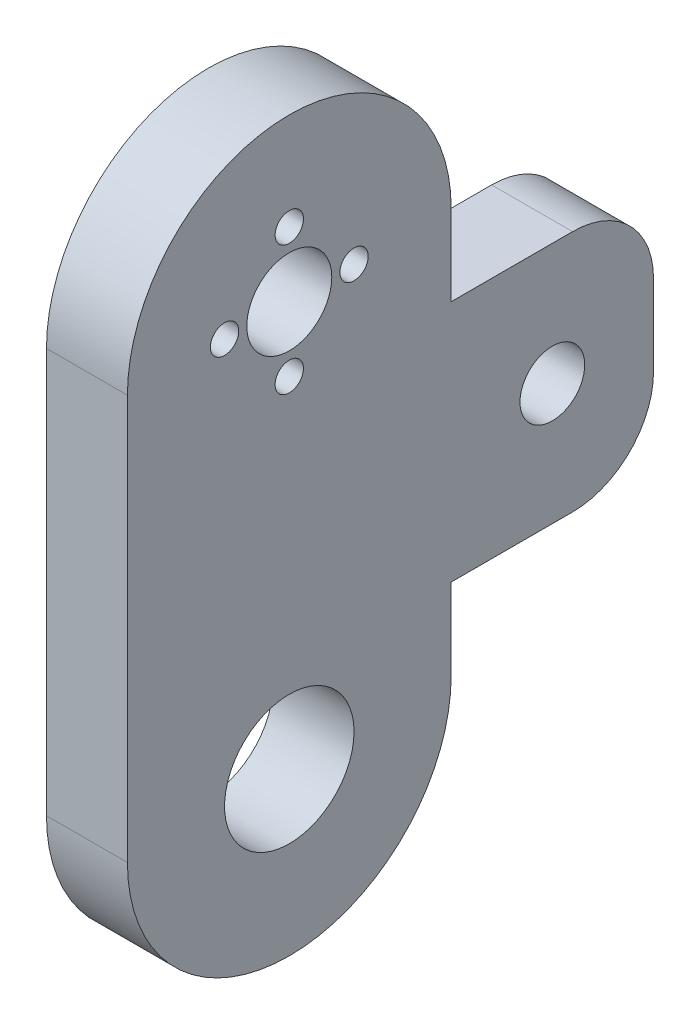
ISO-10303-21;
HEADER;
FILE_DESCRIPTION(('STEP AP214'),'2;1');
FILE_NAME('part.step','',(''),(''),'','','');
FILE_SCHEMA(('AUTOMOTIVE_DESIGN { 1 0 10303 214 1 1 1 1 }'));
ENDSEC;
DATA;
#1=APPLICATION_CONTEXT('core data for automotive mechanical design processes');
#2=APPLICATION_PROTOCOL_DEFINITION('international standard','automotive_design',2000,#1);
#3=PRODUCT_CONTEXT('',#1,'mechanical');
#4=PRODUCT('Part','Part','',(#3));
#5=PRODUCT_RELATED_PRODUCT_CATEGORY('part','',(#4));
#6=PRODUCT_DEFINITION_FORMATION('','',#4);
#7=PRODUCT_DEFINITION_CONTEXT('part definition',#1,'design');
#8=PRODUCT_DEFINITION('design','',#6,#7);
#9=PRODUCT_DEFINITION_SHAPE('','',#8);
#10=(LENGTH_UNIT() NAMED_UNIT(*) SI_UNIT(.MILLI.,.METRE.));
#11=(NAMED_UNIT(*) PLANE_ANGLE_UNIT() SI_UNIT($,.RADIAN.));
#12=(NAMED_UNIT(*) SI_UNIT($,.STERADIAN.) SOLID_ANGLE_UNIT());
#13=UNCERTAINTY_MEASURE_WITH_UNIT(LENGTH_MEASURE(1.E-05),#10,'distance_accuracy_value','');
#14=(GEOMETRIC_REPRESENTATION_CONTEXT(3) GLOBAL_UNCERTAINTY_ASSIGNED_CONTEXT((#13)) GLOBAL_UNIT_ASSIGNED_CONTEXT((#10,
#11,#12)) REPRESENTATION_CONTEXT('',''));
#15=CARTESIAN_POINT('',(0.,0.,0.));
#16=DIRECTION('',(0.,0.,1.));
#17=DIRECTION('',(1.,0.,0.));
#18=AXIS2_PLACEMENT_3D('',#15,#16,#17);
#19=CARTESIAN_POINT('',(10.,25.,0.));
#20=DIRECTION('',(1.,0.,0.));
#21=DIRECTION('',(0.,0.,-1.));
#22=AXIS2_PLACEMENT_3D('',#19,#20,#21);
#23=PLANE('',#22);
#24=CARTESIAN_POINT('',(10.,25.,7.99999999999989));
#25=DIRECTION('',(1.,0.,0.));
#26=DIRECTION('',(0.,0.,-1.));
#27=AXIS2_PLACEMENT_3D('',#24,#25,#26);
#28=CIRCLE('',#27,1.75);
#29=CARTESIAN_POINT('',(10.,25.,6.24999999999989));
#30=VERTEX_POINT('',#29);
#31=EDGE_CURVE('E236',#30,#30,#28,.T.);
#32=ORIENTED_EDGE('',*,*,#31,.F.);
#33=EDGE_LOOP('',(#32));
#34=FACE_BOUND('',#33,.T.);
#35=CARTESIAN_POINT('',(10.,25.0000000000001,-8.00000000000012));
#36=DIRECTION('',(1.,0.,0.));
#37=DIRECTION('',(0.,0.,-1.));
#38=AXIS2_PLACEMENT_3D('',#35,#36,#37);
#39=CIRCLE('',#38,1.75);
#40=CARTESIAN_POINT('',(10.,25.0000000000001,-9.75000000000011));
#41=VERTEX_POINT('',#40);
#42=EDGE_CURVE('E224',#41,#41,#39,.T.);
#43=ORIENTED_EDGE('',*,*,#42,.F.);
#44=EDGE_LOOP('',(#43));
#45=FACE_BOUND('',#44,.T.);
#46=CARTESIAN_POINT('',(10.,-25.,0.));
#47=DIRECTION('',(1.,0.,0.));
#48=DIRECTION('',(0.,0.,-1.));
#49=AXIS2_PLACEMENT_3D('',#46,#47,#48);
#50=CIRCLE('',#49,8.);
#51=CARTESIAN_POINT('',(10.,-25.,-8.));
#52=VERTEX_POINT('',#51);
#53=EDGE_CURVE('E212',#52,#52,#50,.T.);
#54=ORIENTED_EDGE('',*,*,#53,.F.);
#55=EDGE_LOOP('',(#54));
#56=FACE_BOUND('',#55,.T.);
#57=CARTESIAN_POINT('',(10.,25.,0.));
#58=DIRECTION('',(1.,0.,0.));
#59=DIRECTION('',(0.,0.,-1.));
#60=AXIS2_PLACEMENT_3D('',#57,#58,#59);
#61=CIRCLE('',#60,20.);
#62=CARTESIAN_POINT('',(10.,25.,-20.));
#63=VERTEX_POINT('',#62);
#64=CARTESIAN_POINT('',(10.,25.,20.));
#65=VERTEX_POINT('',#64);
#66=EDGE_CURVE('E161',#63,#65,#61,.T.);
#67=ORIENTED_EDGE('',*,*,#66,.T.);
#68=DIRECTION('',(0.,-1.,0.));
#69=VECTOR('',#68,1.);
#70=CARTESIAN_POINT('',(10.,-25.,20.));
#71=LINE('',#70,#69);
#72=CARTESIAN_POINT('',(10.,-25.,20.));
#73=VERTEX_POINT('',#72);
#74=EDGE_CURVE('E99',#65,#73,#71,.T.);
#75=ORIENTED_EDGE('',*,*,#74,.T.);
#76=CARTESIAN_POINT('',(10.,-25.,0.));
#77=DIRECTION('',(1.,0.,0.));
#78=DIRECTION('',(0.,0.,-1.));
#79=AXIS2_PLACEMENT_3D('',#76,#77,#78);
#80=CIRCLE('',#79,20.);
#81=CARTESIAN_POINT('',(10.,-25.,-20.));
#82=VERTEX_POINT('',#81);
#83=EDGE_CURVE('E182',#73,#82,#80,.T.);
#84=ORIENTED_EDGE('',*,*,#83,.T.);
#85=DIRECTION('',(0.,1.,0.));
#86=VECTOR('',#85,1.);
#87=CARTESIAN_POINT('',(10.,-25.,-20.));
#88=LINE('',#87,#86);
#89=CARTESIAN_POINT('',(10.,-15.,-20.));
#90=VERTEX_POINT('',#89);
#91=EDGE_CURVE('E201',#82,#90,#88,.T.);
#92=ORIENTED_EDGE('',*,*,#91,.T.);
#93=DIRECTION('',(0.,0.,-1.));
#94=VECTOR('',#93,1.);
#95=CARTESIAN_POINT('',(10.,-15.,-20.));
#96=LINE('',#95,#94);
#97=CARTESIAN_POINT('',(10.,-15.,-34.9999999999999));
#98=VERTEX_POINT('',#97);
#99=EDGE_CURVE('E198',#90,#98,#96,.T.);
#100=ORIENTED_EDGE('',*,*,#99,.T.);
#101=CARTESIAN_POINT('',(10.,-5.,-35.));
#102=DIRECTION('',(1.,0.,0.));
#103=DIRECTION('',(0.,0.,-1.));
#104=AXIS2_PLACEMENT_3D('',#101,#102,#103);
#105=CIRCLE('',#104,10.);
#106=CARTESIAN_POINT('',(10.,-4.99999999999993,-45.));
#107=VERTEX_POINT('',#106);
#108=EDGE_CURVE('E200',#98,#107,#105,.T.);
#109=ORIENTED_EDGE('',*,*,#108,.T.);
#110=DIRECTION('',(0.,1.,0.));
#111=VECTOR('',#110,1.);
#112=CARTESIAN_POINT('',(10.,-4.99999999999993,-45.));
#113=LINE('',#112,#111);
#114=CARTESIAN_POINT('',(10.,4.99999999999993,-45.));
#115=VERTEX_POINT('',#114);
#116=EDGE_CURVE('E124',#107,#115,#113,.T.);
#117=ORIENTED_EDGE('',*,*,#116,.T.);
#118=CARTESIAN_POINT('',(10.,5.,-35.));
#119=DIRECTION('',(1.,0.,0.));
#120=DIRECTION('',(0.,0.,1.));
#121=AXIS2_PLACEMENT_3D('',#118,#119,#120);
#122=CIRCLE('',#121,10.);
#123=CARTESIAN_POINT('',(10.,15.,-34.9999999999999));
#124=VERTEX_POINT('',#123);
#125=EDGE_CURVE('E118',#115,#124,#122,.T.);
#126=ORIENTED_EDGE('',*,*,#125,.T.);
#127=DIRECTION('',(0.,0.,1.));
#128=VECTOR('',#127,1.);
#129=CARTESIAN_POINT('',(10.,15.,-20.));
#130=LINE('',#129,#128);
#131=CARTESIAN_POINT('',(10.,15.,-20.));
#132=VERTEX_POINT('',#131);
#133=EDGE_CURVE('E122',#124,#132,#130,.T.);
#134=ORIENTED_EDGE('',*,*,#133,.T.);
#135=DIRECTION('',(0.,1.,0.));
#136=VECTOR('',#135,1.);
#137=CARTESIAN_POINT('',(10.,15.,-20.));
#138=LINE('',#137,#136);
#139=EDGE_CURVE('E50',#132,#63,#138,.T.);
#140=ORIENTED_EDGE('',*,*,#139,.T.);
#141=EDGE_LOOP('',(#67,#75,#84,#92,#100,#109,#117,#126,#134,#140));
#142=FACE_BOUND('',#141,.T.);
#143=CARTESIAN_POINT('',(10.,25.,0.));
#144=DIRECTION('',(1.,0.,0.));
#145=DIRECTION('',(0.,0.,-1.));
#146=AXIS2_PLACEMENT_3D('',#143,#144,#145);
#147=CIRCLE('',#146,5.25);
#148=CARTESIAN_POINT('',(10.,25.,-5.25));
#149=VERTEX_POINT('',#148);
#150=EDGE_CURVE('E146',#149,#149,#147,.T.);
#151=ORIENTED_EDGE('',*,*,#150,.F.);
#152=EDGE_LOOP('',(#151));
#153=FACE_BOUND('',#152,.T.);
#154=CARTESIAN_POINT('',(10.,33.,0.));
#155=DIRECTION('',(1.,0.,0.));
#156=DIRECTION('',(0.,0.,-1.));
#157=AXIS2_PLACEMENT_3D('',#154,#155,#156);
#158=CIRCLE('',#157,1.75);
#159=CARTESIAN_POINT('',(10.,33.,-1.75));
#160=VERTEX_POINT('',#159);
#161=EDGE_CURVE('E218',#160,#160,#158,.T.);
#162=ORIENTED_EDGE('',*,*,#161,.F.);
#163=EDGE_LOOP('',(#162));
#164=FACE_BOUND('',#163,.T.);
#165=CARTESIAN_POINT('',(10.,17.,-1.66326021550982E-13));
#166=DIRECTION('',(1.,0.,0.));
#167=DIRECTION('',(0.,0.,-1.));
#168=AXIS2_PLACEMENT_3D('',#165,#166,#167);
#169=CIRCLE('',#168,1.75);
#170=CARTESIAN_POINT('',(10.,17.,-1.75000000000017));
#171=VERTEX_POINT('',#170);
#172=EDGE_CURVE('E230',#171,#171,#169,.T.);
#173=ORIENTED_EDGE('',*,*,#172,.F.);
#174=EDGE_LOOP('',(#173));
#175=FACE_BOUND('',#174,.T.);
#176=CARTESIAN_POINT('',(10.,0.,-32.5));
#177=DIRECTION('',(1.,0.,0.));
#178=DIRECTION('',(0.,0.,-1.));
#179=AXIS2_PLACEMENT_3D('',#176,#177,#178);
#180=CIRCLE('',#179,4.00000000000001);
#181=CARTESIAN_POINT('',(10.,0.,-36.5));
#182=VERTEX_POINT('',#181);
#183=EDGE_CURVE('E242',#182,#182,#180,.T.);
#184=ORIENTED_EDGE('',*,*,#183,.F.);
#185=EDGE_LOOP('',(#184));
#186=FACE_BOUND('',#185,.T.);
#187=ADVANCED_FACE('F33',(#34,#45,#56,#142,#153,#164,#175,#186),#23,.T.);
#188=CARTESIAN_POINT('',(0.,25.,0.));
#189=DIRECTION('',(1.,0.,0.));
#190=DIRECTION('',(0.,0.,-1.));
#191=AXIS2_PLACEMENT_3D('',#188,#189,#190);
#192=PLANE('',#191);
#193=CARTESIAN_POINT('',(0.,25.,7.99999999999989));
#194=DIRECTION('',(1.,0.,0.));
#195=DIRECTION('',(0.,0.,-1.));
#196=AXIS2_PLACEMENT_3D('',#193,#194,#195);
#197=CIRCLE('',#196,1.75);
#198=CARTESIAN_POINT('',(0.,25.,6.24999999999989));
#199=VERTEX_POINT('',#198);
#200=EDGE_CURVE('E239',#199,#199,#197,.T.);
#201=ORIENTED_EDGE('',*,*,#200,.T.);
#202=EDGE_LOOP('',(#201));
#203=FACE_BOUND('',#202,.T.);
#204=CARTESIAN_POINT('',(0.,25.0000000000001,-8.00000000000012));
#205=DIRECTION('',(1.,0.,0.));
#206=DIRECTION('',(0.,0.,-1.));
#207=AXIS2_PLACEMENT_3D('',#204,#205,#206);
#208=CIRCLE('',#207,1.75);
#209=CARTESIAN_POINT('',(0.,25.0000000000001,-9.75000000000011));
#210=VERTEX_POINT('',#209);
#211=EDGE_CURVE('E227',#210,#210,#208,.T.);
#212=ORIENTED_EDGE('',*,*,#211,.T.);
#213=EDGE_LOOP('',(#212));
#214=FACE_BOUND('',#213,.T.);
#215=CARTESIAN_POINT('',(0.,-25.,0.));
#216=DIRECTION('',(1.,0.,0.));
#217=DIRECTION('',(0.,0.,-1.));
#218=AXIS2_PLACEMENT_3D('',#215,#216,#217);
#219=CIRCLE('',#218,8.);
#220=CARTESIAN_POINT('',(0.,-25.,-8.));
#221=VERTEX_POINT('',#220);
#222=EDGE_CURVE('E215',#221,#221,#219,.T.);
#223=ORIENTED_EDGE('',*,*,#222,.T.);
#224=EDGE_LOOP('',(#223));
#225=FACE_BOUND('',#224,.T.);
#226=CARTESIAN_POINT('',(0.,25.,0.));
#227=DIRECTION('',(1.,0.,0.));
#228=DIRECTION('',(0.,0.,-1.));
#229=AXIS2_PLACEMENT_3D('',#226,#227,#228);
#230=CIRCLE('',#229,20.);
#231=CARTESIAN_POINT('',(0.,25.,-20.));
#232=VERTEX_POINT('',#231);
#233=CARTESIAN_POINT('',(0.,25.,20.));
#234=VERTEX_POINT('',#233);
#235=EDGE_CURVE('E142',#232,#234,#230,.T.);
#236=ORIENTED_EDGE('',*,*,#235,.F.);
#237=DIRECTION('',(0.,1.,0.));
#238=VECTOR('',#237,1.);
#239=CARTESIAN_POINT('',(0.,15.,-20.));
#240=LINE('',#239,#238);
#241=CARTESIAN_POINT('',(0.,15.,-20.));
#242=VERTEX_POINT('',#241);
#243=EDGE_CURVE('E91',#242,#232,#240,.T.);
#244=ORIENTED_EDGE('',*,*,#243,.F.);
#245=DIRECTION('',(0.,0.,1.));
#246=VECTOR('',#245,1.);
#247=CARTESIAN_POINT('',(0.,15.,-20.));
#248=LINE('',#247,#246);
#249=CARTESIAN_POINT('',(0.,15.,-34.9999999999999));
#250=VERTEX_POINT('',#249);
#251=EDGE_CURVE('E85',#250,#242,#248,.T.);
#252=ORIENTED_EDGE('',*,*,#251,.F.);
#253=CARTESIAN_POINT('',(0.,5.,-35.));
#254=DIRECTION('',(1.,0.,0.));
#255=DIRECTION('',(0.,0.,1.));
#256=AXIS2_PLACEMENT_3D('',#253,#254,#255);
#257=CIRCLE('',#256,10.);
#258=CARTESIAN_POINT('',(0.,4.99999999999993,-45.));
#259=VERTEX_POINT('',#258);
#260=EDGE_CURVE('E132',#259,#250,#257,.T.);
#261=ORIENTED_EDGE('',*,*,#260,.F.);
#262=DIRECTION('',(0.,1.,0.));
#263=VECTOR('',#262,1.);
#264=CARTESIAN_POINT('',(0.,-4.99999999999993,-45.));
#265=LINE('',#264,#263);
#266=CARTESIAN_POINT('',(0.,-4.99999999999993,-45.));
#267=VERTEX_POINT('',#266);
#268=EDGE_CURVE('E156',#267,#259,#265,.T.);
#269=ORIENTED_EDGE('',*,*,#268,.F.);
#270=CARTESIAN_POINT('',(0.,-5.,-35.));
#271=DIRECTION('',(1.,0.,0.));
#272=DIRECTION('',(0.,0.,-1.));
#273=AXIS2_PLACEMENT_3D('',#270,#271,#272);
#274=CIRCLE('',#273,10.);
#275=CARTESIAN_POINT('',(0.,-15.,-34.9999999999999));
#276=VERTEX_POINT('',#275);
#277=EDGE_CURVE('E154',#276,#267,#274,.T.);
#278=ORIENTED_EDGE('',*,*,#277,.F.);
#279=DIRECTION('',(0.,0.,-1.));
#280=VECTOR('',#279,1.);
#281=CARTESIAN_POINT('',(0.,-15.,-20.));
#282=LINE('',#281,#280);
#283=CARTESIAN_POINT('',(0.,-15.,-20.));
#284=VERTEX_POINT('',#283);
#285=EDGE_CURVE('E152',#284,#276,#282,.T.);
#286=ORIENTED_EDGE('',*,*,#285,.F.);
#287=DIRECTION('',(0.,1.,0.));
#288=VECTOR('',#287,1.);
#289=CARTESIAN_POINT('',(0.,-25.,-20.));
#290=LINE('',#289,#288);
#291=CARTESIAN_POINT('',(0.,-25.,-20.));
#292=VERTEX_POINT('',#291);
#293=EDGE_CURVE('E150',#292,#284,#290,.T.);
#294=ORIENTED_EDGE('',*,*,#293,.F.);
#295=CARTESIAN_POINT('',(0.,-25.,0.));
#296=DIRECTION('',(1.,0.,0.));
#297=DIRECTION('',(0.,0.,-1.));
#298=AXIS2_PLACEMENT_3D('',#295,#296,#297);
#299=CIRCLE('',#298,20.);
#300=CARTESIAN_POINT('',(0.,-25.,20.));
#301=VERTEX_POINT('',#300);
#302=EDGE_CURVE('E148',#301,#292,#299,.T.);
#303=ORIENTED_EDGE('',*,*,#302,.F.);
#304=DIRECTION('',(0.,-1.,0.));
#305=VECTOR('',#304,1.);
#306=CARTESIAN_POINT('',(0.,-25.,20.));
#307=LINE('',#306,#305);
#308=EDGE_CURVE('E145',#234,#301,#307,.T.);
#309=ORIENTED_EDGE('',*,*,#308,.F.);
#310=EDGE_LOOP('',(#236,#244,#252,#261,#269,#278,#286,#294,#303,#309));
#311=FACE_BOUND('',#310,.T.);
#312=CARTESIAN_POINT('',(0.,25.,0.));
#313=DIRECTION('',(1.,0.,0.));
#314=DIRECTION('',(0.,0.,-1.));
#315=AXIS2_PLACEMENT_3D('',#312,#313,#314);
#316=CIRCLE('',#315,5.25);
#317=CARTESIAN_POINT('',(0.,25.,-5.25));
#318=VERTEX_POINT('',#317);
#319=EDGE_CURVE('E209',#318,#318,#316,.T.);
#320=ORIENTED_EDGE('',*,*,#319,.T.);
#321=EDGE_LOOP('',(#320));
#322=FACE_BOUND('',#321,.T.);
#323=CARTESIAN_POINT('',(0.,33.,0.));
#324=DIRECTION('',(1.,0.,0.));
#325=DIRECTION('',(0.,0.,-1.));
#326=AXIS2_PLACEMENT_3D('',#323,#324,#325);
#327=CIRCLE('',#326,1.75);
#328=CARTESIAN_POINT('',(0.,33.,-1.75));
#329=VERTEX_POINT('',#328);
#330=EDGE_CURVE('E221',#329,#329,#327,.T.);
#331=ORIENTED_EDGE('',*,*,#330,.T.);
#332=EDGE_LOOP('',(#331));
#333=FACE_BOUND('',#332,.T.);
#334=CARTESIAN_POINT('',(0.,17.,-1.66326021550982E-13));
#335=DIRECTION('',(1.,0.,0.));
#336=DIRECTION('',(0.,0.,-1.));
#337=AXIS2_PLACEMENT_3D('',#334,#335,#336);
#338=CIRCLE('',#337,1.75);
#339=CARTESIAN_POINT('',(0.,17.,-1.75000000000017));
#340=VERTEX_POINT('',#339);
#341=EDGE_CURVE('E233',#340,#340,#338,.T.);
#342=ORIENTED_EDGE('',*,*,#341,.T.);
#343=EDGE_LOOP('',(#342));
#344=FACE_BOUND('',#343,.T.);
#345=CARTESIAN_POINT('',(0.,0.,-32.5));
#346=DIRECTION('',(1.,0.,0.));
#347=DIRECTION('',(0.,0.,-1.));
#348=AXIS2_PLACEMENT_3D('',#345,#346,#347);
#349=CIRCLE('',#348,4.00000000000001);
#350=CARTESIAN_POINT('',(0.,0.,-36.5));
#351=VERTEX_POINT('',#350);
#352=EDGE_CURVE('E245',#351,#351,#349,.T.);
#353=ORIENTED_EDGE('',*,*,#352,.T.);
#354=EDGE_LOOP('',(#353));
#355=FACE_BOUND('',#354,.T.);
#356=ADVANCED_FACE('F186',(#203,#214,#225,#311,#322,#333,#344,#355),#192,.F.);
#357=CARTESIAN_POINT('',(10.,25.,0.));
#358=DIRECTION('',(-1.,0.,0.));
#359=DIRECTION('',(0.,0.,1.));
#360=AXIS2_PLACEMENT_3D('',#357,#358,#359);
#361=CYLINDRICAL_SURFACE('',#360,20.);
#362=ORIENTED_EDGE('',*,*,#235,.T.);
#363=DIRECTION('',(-1.,0.,0.));
#364=VECTOR('',#363,1.);
#365=CARTESIAN_POINT('',(10.,25.,20.));
#366=LINE('',#365,#364);
#367=EDGE_CURVE('E11',#65,#234,#366,.T.);
#368=ORIENTED_EDGE('',*,*,#367,.F.);
#369=ORIENTED_EDGE('',*,*,#66,.F.);
#370=DIRECTION('',(-1.,0.,0.));
#371=VECTOR('',#370,1.);
#372=CARTESIAN_POINT('',(10.,25.,-20.));
#373=LINE('',#372,#371);
#374=EDGE_CURVE('E138',#63,#232,#373,.T.);
#375=ORIENTED_EDGE('',*,*,#374,.T.);
#376=EDGE_LOOP('',(#362,#368,#369,#375));
#377=FACE_BOUND('',#376,.T.);
#378=ADVANCED_FACE('F35',(#377),#361,.T.);
#379=CARTESIAN_POINT('',(10.,-25.,20.));
#380=DIRECTION('',(0.,0.,-1.));
#381=DIRECTION('',(-1.,0.,0.));
#382=AXIS2_PLACEMENT_3D('',#379,#380,#381);
#383=PLANE('',#382);
#384=ORIENTED_EDGE('',*,*,#308,.T.);
#385=DIRECTION('',(-1.,0.,0.));
#386=VECTOR('',#385,1.);
#387=CARTESIAN_POINT('',(10.,-25.,20.));
#388=LINE('',#387,#386);
#389=EDGE_CURVE('E42',#73,#301,#388,.T.);
#390=ORIENTED_EDGE('',*,*,#389,.F.);
#391=ORIENTED_EDGE('',*,*,#74,.F.);
#392=ORIENTED_EDGE('',*,*,#367,.T.);
#393=EDGE_LOOP('',(#384,#390,#391,#392));
#394=FACE_BOUND('',#393,.T.);
#395=ADVANCED_FACE('F288',(#394),#383,.F.);
#396=CARTESIAN_POINT('',(10.,-25.,0.));
#397=DIRECTION('',(-1.,0.,0.));
#398=DIRECTION('',(0.,0.,1.));
#399=AXIS2_PLACEMENT_3D('',#396,#397,#398);
#400=CYLINDRICAL_SURFACE('',#399,20.);
#401=ORIENTED_EDGE('',*,*,#302,.T.);
#402=DIRECTION('',(-1.,0.,0.));
#403=VECTOR('',#402,1.);
#404=CARTESIAN_POINT('',(10.,-25.,-20.));
#405=LINE('',#404,#403);
#406=EDGE_CURVE('E174',#82,#292,#405,.T.);
#407=ORIENTED_EDGE('',*,*,#406,.F.);
#408=ORIENTED_EDGE('',*,*,#83,.F.);
#409=ORIENTED_EDGE('',*,*,#389,.T.);
#410=EDGE_LOOP('',(#401,#407,#408,#409));
#411=FACE_BOUND('',#410,.T.);
#412=ADVANCED_FACE('F180',(#411),#400,.T.);
#413=CARTESIAN_POINT('',(10.,-25.,-20.));
#414=DIRECTION('',(0.,0.,1.));
#415=DIRECTION('',(1.,0.,0.));
#416=AXIS2_PLACEMENT_3D('',#413,#414,#415);
#417=PLANE('',#416);
#418=ORIENTED_EDGE('',*,*,#293,.T.);
#419=DIRECTION('',(-1.,0.,0.));
#420=VECTOR('',#419,1.);
#421=CARTESIAN_POINT('',(10.,-15.,-20.));
#422=LINE('',#421,#420);
#423=EDGE_CURVE('E171',#90,#284,#422,.T.);
#424=ORIENTED_EDGE('',*,*,#423,.F.);
#425=ORIENTED_EDGE('',*,*,#91,.F.);
#426=ORIENTED_EDGE('',*,*,#406,.T.);
#427=EDGE_LOOP('',(#418,#424,#425,#426));
#428=FACE_BOUND('',#427,.T.);
#429=ADVANCED_FACE('F192',(#428),#417,.F.);
#430=CARTESIAN_POINT('',(10.,-15.,-20.));
#431=DIRECTION('',(0.,1.,0.));
#432=DIRECTION('',(0.,0.,1.));
#433=AXIS2_PLACEMENT_3D('',#430,#431,#432);
#434=PLANE('',#433);
#435=ORIENTED_EDGE('',*,*,#285,.T.);
#436=DIRECTION('',(-1.,0.,0.));
#437=VECTOR('',#436,1.);
#438=CARTESIAN_POINT('',(10.,-15.,-34.9999999999999));
#439=LINE('',#438,#437);
#440=EDGE_CURVE('E168',#98,#276,#439,.T.);
#441=ORIENTED_EDGE('',*,*,#440,.F.);
#442=ORIENTED_EDGE('',*,*,#99,.F.);
#443=ORIENTED_EDGE('',*,*,#423,.T.);
#444=EDGE_LOOP('',(#435,#441,#442,#443));
#445=FACE_BOUND('',#444,.T.);
#446=ADVANCED_FACE('F196',(#445),#434,.F.);
#447=CARTESIAN_POINT('',(10.,-5.,-35.));
#448=DIRECTION('',(-1.,0.,0.));
#449=DIRECTION('',(0.,0.,1.));
#450=AXIS2_PLACEMENT_3D('',#447,#448,#449);
#451=CYLINDRICAL_SURFACE('',#450,10.);
#452=ORIENTED_EDGE('',*,*,#277,.T.);
#453=DIRECTION('',(-1.,0.,0.));
#454=VECTOR('',#453,1.);
#455=CARTESIAN_POINT('',(10.,-4.99999999999993,-45.));
#456=LINE('',#455,#454);
#457=EDGE_CURVE('E165',#107,#267,#456,.T.);
#458=ORIENTED_EDGE('',*,*,#457,.F.);
#459=ORIENTED_EDGE('',*,*,#108,.F.);
#460=ORIENTED_EDGE('',*,*,#440,.T.);
#461=EDGE_LOOP('',(#452,#458,#459,#460));
#462=FACE_BOUND('',#461,.T.);
#463=ADVANCED_FACE('F278',(#462),#451,.T.);
#464=CARTESIAN_POINT('',(10.,-4.99999999999993,-45.));
#465=DIRECTION('',(0.,0.,1.));
#466=DIRECTION('',(1.,0.,0.));
#467=AXIS2_PLACEMENT_3D('',#464,#465,#466);
#468=PLANE('',#467);
#469=ORIENTED_EDGE('',*,*,#268,.T.);
#470=DIRECTION('',(-1.,0.,0.));
#471=VECTOR('',#470,1.);
#472=CARTESIAN_POINT('',(10.,4.99999999999993,-45.));
#473=LINE('',#472,#471);
#474=EDGE_CURVE('E133',#115,#259,#473,.T.);
#475=ORIENTED_EDGE('',*,*,#474,.F.);
#476=ORIENTED_EDGE('',*,*,#116,.F.);
#477=ORIENTED_EDGE('',*,*,#457,.T.);
#478=EDGE_LOOP('',(#469,#475,#476,#477));
#479=FACE_BOUND('',#478,.T.);
#480=ADVANCED_FACE('F275',(#479),#468,.F.);
#481=CARTESIAN_POINT('',(10.,5.,-35.));
#482=DIRECTION('',(-1.,0.,0.));
#483=DIRECTION('',(0.,0.,1.));
#484=AXIS2_PLACEMENT_3D('',#481,#482,#483);
#485=CYLINDRICAL_SURFACE('',#484,10.);
#486=ORIENTED_EDGE('',*,*,#260,.T.);
#487=DIRECTION('',(-1.,0.,0.));
#488=VECTOR('',#487,1.);
#489=CARTESIAN_POINT('',(10.,15.,-34.9999999999999));
#490=LINE('',#489,#488);
#491=EDGE_CURVE('E129',#124,#250,#490,.T.);
#492=ORIENTED_EDGE('',*,*,#491,.F.);
#493=ORIENTED_EDGE('',*,*,#125,.F.);
#494=ORIENTED_EDGE('',*,*,#474,.T.);
#495=EDGE_LOOP('',(#486,#492,#493,#494));
#496=FACE_BOUND('',#495,.T.);
#497=ADVANCED_FACE('F130',(#496),#485,.T.);
#498=CARTESIAN_POINT('',(10.,15.,-20.));
#499=DIRECTION('',(0.,-1.,0.));
#500=DIRECTION('',(0.,0.,-1.));
#501=AXIS2_PLACEMENT_3D('',#498,#499,#500);
#502=PLANE('',#501);
#503=ORIENTED_EDGE('',*,*,#251,.T.);
#504=DIRECTION('',(-1.,0.,0.));
#505=VECTOR('',#504,1.);
#506=CARTESIAN_POINT('',(10.,15.,-20.));
#507=LINE('',#506,#505);
#508=EDGE_CURVE('E134',#132,#242,#507,.T.);
#509=ORIENTED_EDGE('',*,*,#508,.F.);
#510=ORIENTED_EDGE('',*,*,#133,.F.);
#511=ORIENTED_EDGE('',*,*,#491,.T.);
#512=EDGE_LOOP('',(#503,#509,#510,#511));
#513=FACE_BOUND('',#512,.T.);
#514=ADVANCED_FACE('F136',(#513),#502,.F.);
#515=CARTESIAN_POINT('',(10.,15.,-20.));
#516=DIRECTION('',(0.,0.,1.));
#517=DIRECTION('',(1.,0.,0.));
#518=AXIS2_PLACEMENT_3D('',#515,#516,#517);
#519=PLANE('',#518);
#520=ORIENTED_EDGE('',*,*,#243,.T.);
#521=ORIENTED_EDGE('',*,*,#374,.F.);
#522=ORIENTED_EDGE('',*,*,#139,.F.);
#523=ORIENTED_EDGE('',*,*,#508,.T.);
#524=EDGE_LOOP('',(#520,#521,#522,#523));
#525=FACE_BOUND('',#524,.T.);
#526=ADVANCED_FACE('F268',(#525),#519,.F.);
#527=CARTESIAN_POINT('',(10.,25.,0.));
#528=DIRECTION('',(-1.,0.,0.));
#529=DIRECTION('',(0.,0.,1.));
#530=AXIS2_PLACEMENT_3D('',#527,#528,#529);
#531=CYLINDRICAL_SURFACE('',#530,5.25);
#532=ORIENTED_EDGE('',*,*,#150,.T.);
#533=EDGE_LOOP('',(#532));
#534=FACE_BOUND('',#533,.T.);
#535=ORIENTED_EDGE('',*,*,#319,.F.);
#536=EDGE_LOOP('',(#535));
#537=FACE_BOUND('',#536,.T.);
#538=ADVANCED_FACE('F265',(#534,#537),#531,.F.);
#539=CARTESIAN_POINT('',(10.,-25.,0.));
#540=DIRECTION('',(-1.,0.,0.));
#541=DIRECTION('',(0.,0.,1.));
#542=AXIS2_PLACEMENT_3D('',#539,#540,#541);
#543=CYLINDRICAL_SURFACE('',#542,8.);
#544=ORIENTED_EDGE('',*,*,#53,.T.);
#545=EDGE_LOOP('',(#544));
#546=FACE_BOUND('',#545,.T.);
#547=ORIENTED_EDGE('',*,*,#222,.F.);
#548=EDGE_LOOP('',(#547));
#549=FACE_BOUND('',#548,.T.);
#550=ADVANCED_FACE('F364',(#546,#549),#543,.F.);
#551=CARTESIAN_POINT('',(10.,33.,0.));
#552=DIRECTION('',(-1.,0.,0.));
#553=DIRECTION('',(0.,0.,1.));
#554=AXIS2_PLACEMENT_3D('',#551,#552,#553);
#555=CYLINDRICAL_SURFACE('',#554,1.75);
#556=ORIENTED_EDGE('',*,*,#161,.T.);
#557=EDGE_LOOP('',(#556));
#558=FACE_BOUND('',#557,.T.);
#559=ORIENTED_EDGE('',*,*,#330,.F.);
#560=EDGE_LOOP('',(#559));
#561=FACE_BOUND('',#560,.T.);
#562=ADVANCED_FACE('F372',(#558,#561),#555,.F.);
#563=CARTESIAN_POINT('',(10.,25.0000000000001,-8.00000000000012));
#564=DIRECTION('',(-1.,0.,0.));
#565=DIRECTION('',(0.,0.,1.));
#566=AXIS2_PLACEMENT_3D('',#563,#564,#565);
#567=CYLINDRICAL_SURFACE('',#566,1.75);
#568=ORIENTED_EDGE('',*,*,#42,.T.);
#569=EDGE_LOOP('',(#568));
#570=FACE_BOUND('',#569,.T.);
#571=ORIENTED_EDGE('',*,*,#211,.F.);
#572=EDGE_LOOP('',(#571));
#573=FACE_BOUND('',#572,.T.);
#574=ADVANCED_FACE('F380',(#570,#573),#567,.F.);
#575=CARTESIAN_POINT('',(10.,17.,-1.66326021550982E-13));
#576=DIRECTION('',(-1.,0.,0.));
#577=DIRECTION('',(0.,0.,1.));
#578=AXIS2_PLACEMENT_3D('',#575,#576,#577);
#579=CYLINDRICAL_SURFACE('',#578,1.75);
#580=ORIENTED_EDGE('',*,*,#172,.T.);
#581=EDGE_LOOP('',(#580));
#582=FACE_BOUND('',#581,.T.);
#583=ORIENTED_EDGE('',*,*,#341,.F.);
#584=EDGE_LOOP('',(#583));
#585=FACE_BOUND('',#584,.T.);
#586=ADVANCED_FACE('F389',(#582,#585),#579,.F.);
#587=CARTESIAN_POINT('',(10.,25.,7.99999999999989));
#588=DIRECTION('',(-1.,0.,0.));
#589=DIRECTION('',(0.,0.,1.));
#590=AXIS2_PLACEMENT_3D('',#587,#588,#589);
#591=CYLINDRICAL_SURFACE('',#590,1.75);
#592=ORIENTED_EDGE('',*,*,#31,.T.);
#593=EDGE_LOOP('',(#592));
#594=FACE_BOUND('',#593,.T.);
#595=ORIENTED_EDGE('',*,*,#200,.F.);
#596=EDGE_LOOP('',(#595));
#597=FACE_BOUND('',#596,.T.);
#598=ADVANCED_FACE('F398',(#594,#597),#591,.F.);
#599=CARTESIAN_POINT('',(10.,0.,-32.5));
#600=DIRECTION('',(-1.,0.,0.));
#601=DIRECTION('',(0.,0.,1.));
#602=AXIS2_PLACEMENT_3D('',#599,#600,#601);
#603=CYLINDRICAL_SURFACE('',#602,4.00000000000001);
#604=ORIENTED_EDGE('',*,*,#183,.T.);
#605=EDGE_LOOP('',(#604));
#606=FACE_BOUND('',#605,.T.);
#607=ORIENTED_EDGE('',*,*,#352,.F.);
#608=EDGE_LOOP('',(#607));
#609=FACE_BOUND('',#608,.T.);
#610=ADVANCED_FACE('F251',(#606,#609),#603,.F.);
#611=CLOSED_SHELL('',(#187,#356,#378,#395,#412,#429,#446,#463,#480,#497,#514,#526,#538,#550,
#562,#574,#586,#598,#610));
#612=MANIFOLD_SOLID_BREP('B2',#611);
#613=ADVANCED_BREP_SHAPE_REPRESENTATION('',(#18,#612),#14);
#614=SHAPE_DEFINITION_REPRESENTATION(#9,#613);
ENDSEC;
END-ISO-10303-21;
